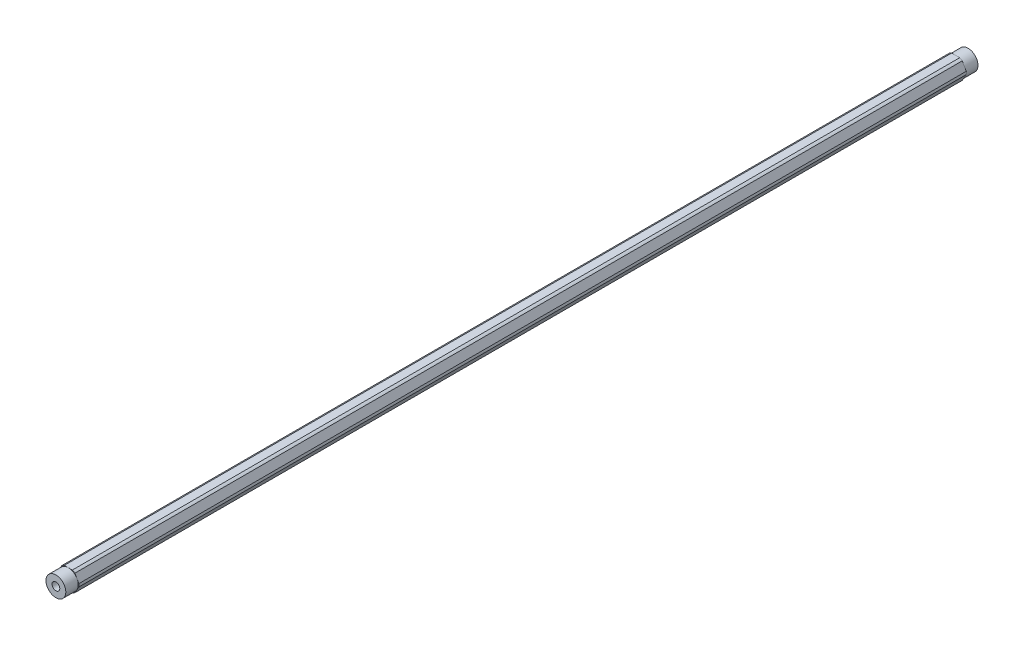
ISO-10303-21;
HEADER;
FILE_DESCRIPTION(('STEP AP214'),'2;1');
FILE_NAME('part.step','',(''),(''),'','','');
FILE_SCHEMA(('AUTOMOTIVE_DESIGN { 1 0 10303 214 1 1 1 1 }'));
ENDSEC;
DATA;
#1=APPLICATION_CONTEXT('core data for automotive mechanical design processes');
#2=APPLICATION_PROTOCOL_DEFINITION('international standard','automotive_design',2000,#1);
#3=PRODUCT_CONTEXT('',#1,'mechanical');
#4=PRODUCT('Part','Part','',(#3));
#5=PRODUCT_RELATED_PRODUCT_CATEGORY('part','',(#4));
#6=PRODUCT_DEFINITION_FORMATION('','',#4);
#7=PRODUCT_DEFINITION_CONTEXT('part definition',#1,'design');
#8=PRODUCT_DEFINITION('design','',#6,#7);
#9=PRODUCT_DEFINITION_SHAPE('','',#8);
#10=(LENGTH_UNIT() NAMED_UNIT(*) SI_UNIT(.MILLI.,.METRE.));
#11=(NAMED_UNIT(*) PLANE_ANGLE_UNIT() SI_UNIT($,.RADIAN.));
#12=(NAMED_UNIT(*) SI_UNIT($,.STERADIAN.) SOLID_ANGLE_UNIT());
#13=UNCERTAINTY_MEASURE_WITH_UNIT(LENGTH_MEASURE(1.E-05),#10,'distance_accuracy_value','');
#14=(GEOMETRIC_REPRESENTATION_CONTEXT(3) GLOBAL_UNCERTAINTY_ASSIGNED_CONTEXT((#13)) GLOBAL_UNIT_ASSIGNED_CONTEXT((#10,
#11,#12)) REPRESENTATION_CONTEXT('',''));
#15=CARTESIAN_POINT('',(0.,0.,0.));
#16=DIRECTION('',(0.,0.,1.));
#17=DIRECTION('',(1.,0.,0.));
#18=AXIS2_PLACEMENT_3D('',#15,#16,#17);
#19=CARTESIAN_POINT('',(3.66617420935413,-6.35,292.1));
#20=DIRECTION('',(-0.866025403784439,0.499999999999999,0.));
#21=DIRECTION('',(-0.499999999999999,-0.866025403784439,0.));
#22=AXIS2_PLACEMENT_3D('',#19,#20,#21);
#23=PLANE('',#22);
#24=DIRECTION('',(0.,0.,1.));
#25=VECTOR('',#24,1.);
#26=CARTESIAN_POINT('',(4.20411035757863,-5.41826726004726,-292.1));
#27=LINE('',#26,#25);
#28=CARTESIAN_POINT('',(4.20411035757863,-5.41826726004727,-284.1498));
#29=VERTEX_POINT('',#28);
#30=CARTESIAN_POINT('',(4.20411035757863,-5.41826726004726,284.1498));
#31=VERTEX_POINT('',#30);
#32=EDGE_CURVE('E327',#29,#31,#27,.T.);
#33=ORIENTED_EDGE('',*,*,#32,.F.);
#34=DIRECTION('',(-0.499999999999999,-0.866025403784439,0.));
#35=VECTOR('',#34,1.);
#36=CARTESIAN_POINT('',(3.66617420935413,-6.35,-284.1498));
#37=LINE('',#36,#35);
#38=CARTESIAN_POINT('',(5.49926131403119,-3.175,-284.1498));
#39=VERTEX_POINT('',#38);
#40=EDGE_CURVE('E257',#39,#29,#37,.T.);
#41=ORIENTED_EDGE('',*,*,#40,.F.);
#42=CARTESIAN_POINT('',(6.79441227048375,-0.931732739952729,-284.1498));
#43=VERTEX_POINT('',#42);
#44=EDGE_CURVE('E261',#43,#39,#37,.T.);
#45=ORIENTED_EDGE('',*,*,#44,.F.);
#46=DIRECTION('',(0.,0.,1.));
#47=VECTOR('',#46,1.);
#48=CARTESIAN_POINT('',(6.79441227048375,-0.931732739952731,-292.1));
#49=LINE('',#48,#47);
#50=CARTESIAN_POINT('',(6.79441227048375,-0.931732739952731,284.1498));
#51=VERTEX_POINT('',#50);
#52=EDGE_CURVE('E299',#51,#43,#49,.F.);
#53=ORIENTED_EDGE('',*,*,#52,.F.);
#54=DIRECTION('',(0.499999999999999,0.866025403784439,0.));
#55=VECTOR('',#54,1.);
#56=CARTESIAN_POINT('',(3.66617420935413,-6.35,284.1498));
#57=LINE('',#56,#55);
#58=CARTESIAN_POINT('',(5.49926131403119,-3.175,284.1498));
#59=VERTEX_POINT('',#58);
#60=EDGE_CURVE('E212',#59,#51,#57,.T.);
#61=ORIENTED_EDGE('',*,*,#60,.F.);
#62=EDGE_CURVE('E211',#31,#59,#57,.T.);
#63=ORIENTED_EDGE('',*,*,#62,.F.);
#64=EDGE_LOOP('',(#33,#41,#45,#53,#61,#63));
#65=FACE_BOUND('',#64,.T.);
#66=ADVANCED_FACE('F48',(#65),#23,.F.);
#67=CARTESIAN_POINT('',(7.33234841870825,0.,292.1));
#68=DIRECTION('',(-0.866025403784439,-0.5,0.));
#69=DIRECTION('',(0.5,-0.866025403784439,0.));
#70=AXIS2_PLACEMENT_3D('',#67,#68,#69);
#71=PLANE('',#70);
#72=DIRECTION('',(0.,0.,1.));
#73=VECTOR('',#72,1.);
#74=CARTESIAN_POINT('',(6.79441227048375,0.931732739952728,-292.1));
#75=LINE('',#74,#73);
#76=CARTESIAN_POINT('',(6.79441227048375,0.931732739952728,-284.1498));
#77=VERTEX_POINT('',#76);
#78=CARTESIAN_POINT('',(6.79441227048375,0.931732739952728,284.1498));
#79=VERTEX_POINT('',#78);
#80=EDGE_CURVE('E302',#77,#79,#75,.T.);
#81=ORIENTED_EDGE('',*,*,#80,.F.);
#82=DIRECTION('',(0.5,-0.866025403784439,0.));
#83=VECTOR('',#82,1.);
#84=CARTESIAN_POINT('',(7.33234841870825,0.,-284.1498));
#85=LINE('',#84,#83);
#86=CARTESIAN_POINT('',(5.49926131403118,3.175,-284.1498));
#87=VERTEX_POINT('',#86);
#88=EDGE_CURVE('E248',#87,#77,#85,.T.);
#89=ORIENTED_EDGE('',*,*,#88,.F.);
#90=CARTESIAN_POINT('',(4.20411035757862,5.41826726004727,-284.1498));
#91=VERTEX_POINT('',#90);
#92=EDGE_CURVE('E252',#91,#87,#85,.T.);
#93=ORIENTED_EDGE('',*,*,#92,.F.);
#94=DIRECTION('',(0.,0.,1.));
#95=VECTOR('',#94,1.);
#96=CARTESIAN_POINT('',(4.20411035757862,5.41826726004727,-292.1));
#97=LINE('',#96,#95);
#98=CARTESIAN_POINT('',(4.20411035757862,5.41826726004727,284.1498));
#99=VERTEX_POINT('',#98);
#100=EDGE_CURVE('E71',#99,#91,#97,.F.);
#101=ORIENTED_EDGE('',*,*,#100,.F.);
#102=DIRECTION('',(-0.5,0.866025403784439,0.));
#103=VECTOR('',#102,1.);
#104=CARTESIAN_POINT('',(7.33234841870825,0.,284.1498));
#105=LINE('',#104,#103);
#106=CARTESIAN_POINT('',(5.49926131403118,3.175,284.1498));
#107=VERTEX_POINT('',#106);
#108=EDGE_CURVE('E217',#107,#99,#105,.T.);
#109=ORIENTED_EDGE('',*,*,#108,.F.);
#110=EDGE_CURVE('E216',#79,#107,#105,.T.);
#111=ORIENTED_EDGE('',*,*,#110,.F.);
#112=EDGE_LOOP('',(#81,#89,#93,#101,#109,#111));
#113=FACE_BOUND('',#112,.T.);
#114=ADVANCED_FACE('F427',(#113),#71,.F.);
#115=CARTESIAN_POINT('',(3.66617420935412,6.35,292.1));
#116=DIRECTION('',(0.,-1.,0.));
#117=DIRECTION('',(0.,0.,-1.));
#118=AXIS2_PLACEMENT_3D('',#115,#116,#117);
#119=PLANE('',#118);
#120=DIRECTION('',(0.,0.,1.));
#121=VECTOR('',#120,1.);
#122=CARTESIAN_POINT('',(2.59030191290514,6.35,-292.1));
#123=LINE('',#122,#121);
#124=CARTESIAN_POINT('',(2.59030191290514,6.35,-284.1498));
#125=VERTEX_POINT('',#124);
#126=CARTESIAN_POINT('',(2.59030191290514,6.35,284.1498));
#127=VERTEX_POINT('',#126);
#128=EDGE_CURVE('E289',#125,#127,#123,.T.);
#129=ORIENTED_EDGE('',*,*,#128,.F.);
#130=DIRECTION('',(1.,0.,0.));
#131=VECTOR('',#130,1.);
#132=CARTESIAN_POINT('',(3.66617420935412,6.35,-284.1498));
#133=LINE('',#132,#131);
#134=CARTESIAN_POINT('',(0.,6.35,-284.1498));
#135=VERTEX_POINT('',#134);
#136=EDGE_CURVE('E242',#135,#125,#133,.T.);
#137=ORIENTED_EDGE('',*,*,#136,.F.);
#138=CARTESIAN_POINT('',(-2.59030191290514,6.35,-284.1498));
#139=VERTEX_POINT('',#138);
#140=EDGE_CURVE('E246',#139,#135,#133,.T.);
#141=ORIENTED_EDGE('',*,*,#140,.F.);
#142=DIRECTION('',(0.,0.,1.));
#143=VECTOR('',#142,1.);
#144=CARTESIAN_POINT('',(-2.59030191290514,6.35,-292.1));
#145=LINE('',#144,#143);
#146=CARTESIAN_POINT('',(-2.59030191290514,6.35,284.1498));
#147=VERTEX_POINT('',#146);
#148=EDGE_CURVE('E63',#147,#139,#145,.F.);
#149=ORIENTED_EDGE('',*,*,#148,.F.);
#150=DIRECTION('',(-1.,0.,0.));
#151=VECTOR('',#150,1.);
#152=CARTESIAN_POINT('',(3.66617420935412,6.35,284.1498));
#153=LINE('',#152,#151);
#154=CARTESIAN_POINT('',(0.,6.35,284.1498));
#155=VERTEX_POINT('',#154);
#156=EDGE_CURVE('E222',#155,#147,#153,.T.);
#157=ORIENTED_EDGE('',*,*,#156,.F.);
#158=EDGE_CURVE('E221',#127,#155,#153,.T.);
#159=ORIENTED_EDGE('',*,*,#158,.F.);
#160=EDGE_LOOP('',(#129,#137,#141,#149,#157,#159));
#161=FACE_BOUND('',#160,.T.);
#162=ADVANCED_FACE('F417',(#161),#119,.F.);
#163=CARTESIAN_POINT('',(-3.66617420935412,6.35,292.1));
#164=DIRECTION('',(0.866025403784439,-0.5,0.));
#165=DIRECTION('',(0.5,0.866025403784439,0.));
#166=AXIS2_PLACEMENT_3D('',#163,#164,#165);
#167=PLANE('',#166);
#168=DIRECTION('',(0.,0.,1.));
#169=VECTOR('',#168,1.);
#170=CARTESIAN_POINT('',(-4.20411035757862,5.41826726004727,-292.1));
#171=LINE('',#170,#169);
#172=CARTESIAN_POINT('',(-4.20411035757862,5.41826726004727,-284.1498));
#173=VERTEX_POINT('',#172);
#174=CARTESIAN_POINT('',(-4.20411035757862,5.41826726004727,284.1498));
#175=VERTEX_POINT('',#174);
#176=EDGE_CURVE('E277',#173,#175,#171,.T.);
#177=ORIENTED_EDGE('',*,*,#176,.F.);
#178=DIRECTION('',(0.5,0.866025403784439,0.));
#179=VECTOR('',#178,1.);
#180=CARTESIAN_POINT('',(-3.66617420935412,6.35,-284.1498));
#181=LINE('',#180,#179);
#182=CARTESIAN_POINT('',(-5.49926131403119,3.175,-284.1498));
#183=VERTEX_POINT('',#182);
#184=EDGE_CURVE('E247',#183,#173,#181,.T.);
#185=ORIENTED_EDGE('',*,*,#184,.F.);
#186=CARTESIAN_POINT('',(-6.79441227048375,0.931732739952721,-284.1498));
#187=VERTEX_POINT('',#186);
#188=EDGE_CURVE('E253',#187,#183,#181,.T.);
#189=ORIENTED_EDGE('',*,*,#188,.F.);
#190=DIRECTION('',(0.,0.,1.));
#191=VECTOR('',#190,1.);
#192=CARTESIAN_POINT('',(-6.79441227048375,0.931732739952721,-292.1));
#193=LINE('',#192,#191);
#194=CARTESIAN_POINT('',(-6.79441227048375,0.931732739952721,284.1498));
#195=VERTEX_POINT('',#194);
#196=EDGE_CURVE('E313',#195,#187,#193,.F.);
#197=ORIENTED_EDGE('',*,*,#196,.F.);
#198=DIRECTION('',(-0.5,-0.866025403784439,0.));
#199=VECTOR('',#198,1.);
#200=CARTESIAN_POINT('',(-3.66617420935412,6.35,284.1498));
#201=LINE('',#200,#199);
#202=CARTESIAN_POINT('',(-5.49926131403119,3.175,284.1498));
#203=VERTEX_POINT('',#202);
#204=EDGE_CURVE('E227',#203,#195,#201,.T.);
#205=ORIENTED_EDGE('',*,*,#204,.F.);
#206=EDGE_CURVE('E226',#175,#203,#201,.T.);
#207=ORIENTED_EDGE('',*,*,#206,.F.);
#208=EDGE_LOOP('',(#177,#185,#189,#197,#205,#207));
#209=FACE_BOUND('',#208,.T.);
#210=ADVANCED_FACE('F433',(#209),#167,.F.);
#211=CARTESIAN_POINT('',(-7.33234841870825,0.,292.1));
#212=DIRECTION('',(0.866025403784439,0.5,0.));
#213=DIRECTION('',(-0.5,0.866025403784439,0.));
#214=AXIS2_PLACEMENT_3D('',#211,#212,#213);
#215=PLANE('',#214);
#216=DIRECTION('',(0.,0.,1.));
#217=VECTOR('',#216,1.);
#218=CARTESIAN_POINT('',(-6.79441227048375,-0.931732739952728,-292.1));
#219=LINE('',#218,#217);
#220=CARTESIAN_POINT('',(-6.79441227048375,-0.931732739952726,-284.1498));
#221=VERTEX_POINT('',#220);
#222=CARTESIAN_POINT('',(-6.79441227048375,-0.931732739952728,284.1498));
#223=VERTEX_POINT('',#222);
#224=EDGE_CURVE('E316',#221,#223,#219,.T.);
#225=ORIENTED_EDGE('',*,*,#224,.F.);
#226=DIRECTION('',(-0.5,0.866025403784439,0.));
#227=VECTOR('',#226,1.);
#228=CARTESIAN_POINT('',(-7.33234841870825,0.,-284.1498));
#229=LINE('',#228,#227);
#230=CARTESIAN_POINT('',(-5.49926131403118,-3.175,-284.1498));
#231=VERTEX_POINT('',#230);
#232=EDGE_CURVE('E256',#231,#221,#229,.T.);
#233=ORIENTED_EDGE('',*,*,#232,.F.);
#234=CARTESIAN_POINT('',(-4.20411035757862,-5.41826726004728,-284.1498));
#235=VERTEX_POINT('',#234);
#236=EDGE_CURVE('E262',#235,#231,#229,.T.);
#237=ORIENTED_EDGE('',*,*,#236,.F.);
#238=DIRECTION('',(0.,0.,1.));
#239=VECTOR('',#238,1.);
#240=CARTESIAN_POINT('',(-4.20411035757862,-5.41826726004727,-292.1));
#241=LINE('',#240,#239);
#242=CARTESIAN_POINT('',(-4.20411035757862,-5.41826726004727,284.1498));
#243=VERTEX_POINT('',#242);
#244=EDGE_CURVE('E176',#243,#235,#241,.F.);
#245=ORIENTED_EDGE('',*,*,#244,.F.);
#246=DIRECTION('',(0.5,-0.866025403784439,0.));
#247=VECTOR('',#246,1.);
#248=CARTESIAN_POINT('',(-7.33234841870825,0.,284.1498));
#249=LINE('',#248,#247);
#250=CARTESIAN_POINT('',(-5.49926131403118,-3.175,284.1498));
#251=VERTEX_POINT('',#250);
#252=EDGE_CURVE('E232',#251,#243,#249,.T.);
#253=ORIENTED_EDGE('',*,*,#252,.F.);
#254=EDGE_CURVE('E231',#223,#251,#249,.T.);
#255=ORIENTED_EDGE('',*,*,#254,.F.);
#256=EDGE_LOOP('',(#225,#233,#237,#245,#253,#255));
#257=FACE_BOUND('',#256,.T.);
#258=ADVANCED_FACE('F450',(#257),#215,.F.);
#259=CARTESIAN_POINT('',(-3.66617420935412,-6.35000000000001,292.1));
#260=DIRECTION('',(0.,1.,0.));
#261=DIRECTION('',(-1.,0.,0.));
#262=AXIS2_PLACEMENT_3D('',#259,#260,#261);
#263=PLANE('',#262);
#264=DIRECTION('',(0.,0.,1.));
#265=VECTOR('',#264,1.);
#266=CARTESIAN_POINT('',(-2.59030191290512,-6.35000000000001,-292.1));
#267=LINE('',#266,#265);
#268=CARTESIAN_POINT('',(-2.59030191290512,-6.35000000000001,-284.1498));
#269=VERTEX_POINT('',#268);
#270=CARTESIAN_POINT('',(-2.59030191290512,-6.35000000000001,284.1498));
#271=VERTEX_POINT('',#270);
#272=EDGE_CURVE('E173',#269,#271,#267,.T.);
#273=ORIENTED_EDGE('',*,*,#272,.F.);
#274=DIRECTION('',(-1.,0.,0.));
#275=VECTOR('',#274,1.);
#276=CARTESIAN_POINT('',(-3.66617420935412,-6.35000000000001,-284.1498));
#277=LINE('',#276,#275);
#278=CARTESIAN_POINT('',(0.,-6.35,-284.1498));
#279=VERTEX_POINT('',#278);
#280=EDGE_CURVE('E185',#279,#269,#277,.T.);
#281=ORIENTED_EDGE('',*,*,#280,.F.);
#282=CARTESIAN_POINT('',(2.59030191290513,-6.35,-284.1498));
#283=VERTEX_POINT('',#282);
#284=EDGE_CURVE('E56',#283,#279,#277,.T.);
#285=ORIENTED_EDGE('',*,*,#284,.F.);
#286=DIRECTION('',(0.,0.,1.));
#287=VECTOR('',#286,1.);
#288=CARTESIAN_POINT('',(2.59030191290513,-6.35,-292.1));
#289=LINE('',#288,#287);
#290=CARTESIAN_POINT('',(2.59030191290513,-6.35,284.1498));
#291=VERTEX_POINT('',#290);
#292=EDGE_CURVE('E330',#291,#283,#289,.F.);
#293=ORIENTED_EDGE('',*,*,#292,.F.);
#294=DIRECTION('',(1.,0.,0.));
#295=VECTOR('',#294,1.);
#296=CARTESIAN_POINT('',(-3.66617420935412,-6.35000000000001,284.1498));
#297=LINE('',#296,#295);
#298=CARTESIAN_POINT('',(0.,-6.35,284.1498));
#299=VERTEX_POINT('',#298);
#300=EDGE_CURVE('E203',#299,#291,#297,.T.);
#301=ORIENTED_EDGE('',*,*,#300,.F.);
#302=EDGE_CURVE('E187',#271,#299,#297,.T.);
#303=ORIENTED_EDGE('',*,*,#302,.F.);
#304=EDGE_LOOP('',(#273,#281,#285,#293,#301,#303));
#305=FACE_BOUND('',#304,.T.);
#306=ADVANCED_FACE('F183',(#305),#263,.F.);
#307=CARTESIAN_POINT('',(0.,0.,284.1498));
#308=DIRECTION('',(0.,0.,1.));
#309=DIRECTION('',(1.,0.,0.));
#310=AXIS2_PLACEMENT_3D('',#307,#308,#309);
#311=PLANE('',#310);
#312=ORIENTED_EDGE('',*,*,#300,.T.);
#313=CARTESIAN_POINT('',(0.,0.,284.1498));
#314=DIRECTION('',(0.,0.,1.));
#315=DIRECTION('',(1.,0.,0.));
#316=AXIS2_PLACEMENT_3D('',#313,#314,#315);
#317=CIRCLE('',#316,6.858);
#318=EDGE_CURVE('E323',#291,#31,#317,.T.);
#319=ORIENTED_EDGE('',*,*,#318,.T.);
#320=ORIENTED_EDGE('',*,*,#62,.T.);
#321=CARTESIAN_POINT('',(0.,0.,284.1498));
#322=DIRECTION('',(0.,0.,1.));
#323=DIRECTION('',(1.,0.,0.));
#324=AXIS2_PLACEMENT_3D('',#321,#322,#323);
#325=CIRCLE('',#324,6.35);
#326=EDGE_CURVE('E375',#299,#59,#325,.T.);
#327=ORIENTED_EDGE('',*,*,#326,.F.);
#328=EDGE_LOOP('',(#312,#319,#320,#327));
#329=FACE_BOUND('',#328,.T.);
#330=ADVANCED_FACE('F480',(#329),#311,.T.);
#331=ORIENTED_EDGE('',*,*,#60,.T.);
#332=CARTESIAN_POINT('',(0.,0.,284.1498));
#333=DIRECTION('',(0.,0.,1.));
#334=DIRECTION('',(1.,0.,0.));
#335=AXIS2_PLACEMENT_3D('',#332,#333,#334);
#336=CIRCLE('',#335,6.858);
#337=EDGE_CURVE('E295',#51,#79,#336,.T.);
#338=ORIENTED_EDGE('',*,*,#337,.T.);
#339=ORIENTED_EDGE('',*,*,#110,.T.);
#340=EDGE_CURVE('E241',#59,#107,#325,.T.);
#341=ORIENTED_EDGE('',*,*,#340,.F.);
#342=EDGE_LOOP('',(#331,#338,#339,#341));
#343=FACE_BOUND('',#342,.T.);
#344=ADVANCED_FACE('F390',(#343),#311,.T.);
#345=ORIENTED_EDGE('',*,*,#108,.T.);
#346=CARTESIAN_POINT('',(0.,0.,284.1498));
#347=DIRECTION('',(0.,0.,1.));
#348=DIRECTION('',(1.,0.,0.));
#349=AXIS2_PLACEMENT_3D('',#346,#347,#348);
#350=CIRCLE('',#349,6.858);
#351=EDGE_CURVE('E283',#99,#127,#350,.T.);
#352=ORIENTED_EDGE('',*,*,#351,.T.);
#353=ORIENTED_EDGE('',*,*,#158,.T.);
#354=EDGE_CURVE('E236',#107,#155,#325,.T.);
#355=ORIENTED_EDGE('',*,*,#354,.F.);
#356=EDGE_LOOP('',(#345,#352,#353,#355));
#357=FACE_BOUND('',#356,.T.);
#358=ADVANCED_FACE('F422',(#357),#311,.T.);
#359=ORIENTED_EDGE('',*,*,#156,.T.);
#360=CARTESIAN_POINT('',(0.,0.,284.1498));
#361=DIRECTION('',(0.,0.,1.));
#362=DIRECTION('',(1.,0.,0.));
#363=AXIS2_PLACEMENT_3D('',#360,#361,#362);
#364=CIRCLE('',#363,6.858);
#365=EDGE_CURVE('E271',#147,#175,#364,.T.);
#366=ORIENTED_EDGE('',*,*,#365,.T.);
#367=ORIENTED_EDGE('',*,*,#206,.T.);
#368=EDGE_CURVE('E240',#155,#203,#325,.T.);
#369=ORIENTED_EDGE('',*,*,#368,.F.);
#370=EDGE_LOOP('',(#359,#366,#367,#369));
#371=FACE_BOUND('',#370,.T.);
#372=ADVANCED_FACE('F438',(#371),#311,.T.);
#373=ORIENTED_EDGE('',*,*,#204,.T.);
#374=CARTESIAN_POINT('',(0.,0.,284.1498));
#375=DIRECTION('',(0.,0.,1.));
#376=DIRECTION('',(1.,0.,0.));
#377=AXIS2_PLACEMENT_3D('',#374,#375,#376);
#378=CIRCLE('',#377,6.858);
#379=EDGE_CURVE('E309',#195,#223,#378,.T.);
#380=ORIENTED_EDGE('',*,*,#379,.T.);
#381=ORIENTED_EDGE('',*,*,#254,.T.);
#382=EDGE_CURVE('E442',#203,#251,#325,.T.);
#383=ORIENTED_EDGE('',*,*,#382,.F.);
#384=EDGE_LOOP('',(#373,#380,#381,#383));
#385=FACE_BOUND('',#384,.T.);
#386=ADVANCED_FACE('F459',(#385),#311,.T.);
#387=ORIENTED_EDGE('',*,*,#252,.T.);
#388=CARTESIAN_POINT('',(0.,0.,284.1498));
#389=DIRECTION('',(0.,0.,1.));
#390=DIRECTION('',(1.,0.,0.));
#391=AXIS2_PLACEMENT_3D('',#388,#389,#390);
#392=CIRCLE('',#391,6.858);
#393=EDGE_CURVE('E337',#243,#271,#392,.T.);
#394=ORIENTED_EDGE('',*,*,#393,.T.);
#395=ORIENTED_EDGE('',*,*,#302,.T.);
#396=EDGE_CURVE('E381',#251,#299,#325,.T.);
#397=ORIENTED_EDGE('',*,*,#396,.F.);
#398=EDGE_LOOP('',(#387,#394,#395,#397));
#399=FACE_BOUND('',#398,.T.);
#400=ADVANCED_FACE('F452',(#399),#311,.T.);
#401=CARTESIAN_POINT('',(0.,0.,-284.1498));
#402=DIRECTION('',(0.,0.,-1.));
#403=DIRECTION('',(-1.,0.,0.));
#404=AXIS2_PLACEMENT_3D('',#401,#402,#403);
#405=PLANE('',#404);
#406=ORIENTED_EDGE('',*,*,#184,.T.);
#407=CARTESIAN_POINT('',(0.,0.,-284.1498));
#408=DIRECTION('',(0.,0.,-1.));
#409=DIRECTION('',(-1.,0.,0.));
#410=AXIS2_PLACEMENT_3D('',#407,#408,#409);
#411=CIRCLE('',#410,6.858);
#412=EDGE_CURVE('E280',#173,#139,#411,.T.);
#413=ORIENTED_EDGE('',*,*,#412,.T.);
#414=ORIENTED_EDGE('',*,*,#140,.T.);
#415=CARTESIAN_POINT('',(0.,0.,-284.1498));
#416=DIRECTION('',(0.,0.,1.));
#417=DIRECTION('',(1.,0.,0.));
#418=AXIS2_PLACEMENT_3D('',#415,#416,#417);
#419=CIRCLE('',#418,6.35);
#420=EDGE_CURVE('E269',#135,#183,#419,.T.);
#421=ORIENTED_EDGE('',*,*,#420,.T.);
#422=EDGE_LOOP('',(#406,#413,#414,#421));
#423=FACE_BOUND('',#422,.T.);
#424=ADVANCED_FACE('F399',(#423),#405,.T.);
#425=ORIENTED_EDGE('',*,*,#136,.T.);
#426=CARTESIAN_POINT('',(0.,0.,-284.1498));
#427=DIRECTION('',(0.,0.,-1.));
#428=DIRECTION('',(-1.,0.,0.));
#429=AXIS2_PLACEMENT_3D('',#426,#427,#428);
#430=CIRCLE('',#429,6.858);
#431=EDGE_CURVE('E292',#125,#91,#430,.T.);
#432=ORIENTED_EDGE('',*,*,#431,.T.);
#433=ORIENTED_EDGE('',*,*,#92,.T.);
#434=EDGE_CURVE('E265',#87,#135,#419,.T.);
#435=ORIENTED_EDGE('',*,*,#434,.T.);
#436=EDGE_LOOP('',(#425,#432,#433,#435));
#437=FACE_BOUND('',#436,.T.);
#438=ADVANCED_FACE('F413',(#437),#405,.T.);
#439=ORIENTED_EDGE('',*,*,#88,.T.);
#440=CARTESIAN_POINT('',(0.,0.,-284.1498));
#441=DIRECTION('',(0.,0.,-1.));
#442=DIRECTION('',(-1.,0.,0.));
#443=AXIS2_PLACEMENT_3D('',#440,#441,#442);
#444=CIRCLE('',#443,6.858);
#445=EDGE_CURVE('E305',#77,#43,#444,.T.);
#446=ORIENTED_EDGE('',*,*,#445,.T.);
#447=ORIENTED_EDGE('',*,*,#44,.T.);
#448=EDGE_CURVE('E270',#39,#87,#419,.T.);
#449=ORIENTED_EDGE('',*,*,#448,.T.);
#450=EDGE_LOOP('',(#439,#446,#447,#449));
#451=FACE_BOUND('',#450,.T.);
#452=ADVANCED_FACE('F469',(#451),#405,.T.);
#453=ORIENTED_EDGE('',*,*,#232,.T.);
#454=CARTESIAN_POINT('',(0.,0.,-284.1498));
#455=DIRECTION('',(0.,0.,-1.));
#456=DIRECTION('',(-1.,0.,0.));
#457=AXIS2_PLACEMENT_3D('',#454,#455,#456);
#458=CIRCLE('',#457,6.858);
#459=EDGE_CURVE('E319',#221,#187,#458,.T.);
#460=ORIENTED_EDGE('',*,*,#459,.T.);
#461=ORIENTED_EDGE('',*,*,#188,.T.);
#462=EDGE_CURVE('E410',#183,#231,#419,.T.);
#463=ORIENTED_EDGE('',*,*,#462,.T.);
#464=EDGE_LOOP('',(#453,#460,#461,#463));
#465=FACE_BOUND('',#464,.T.);
#466=ADVANCED_FACE('F465',(#465),#405,.T.);
#467=ORIENTED_EDGE('',*,*,#40,.T.);
#468=CARTESIAN_POINT('',(0.,0.,-284.1498));
#469=DIRECTION('',(0.,0.,-1.));
#470=DIRECTION('',(-1.,0.,0.));
#471=AXIS2_PLACEMENT_3D('',#468,#469,#470);
#472=CIRCLE('',#471,6.858);
#473=EDGE_CURVE('E333',#29,#283,#472,.T.);
#474=ORIENTED_EDGE('',*,*,#473,.T.);
#475=ORIENTED_EDGE('',*,*,#284,.T.);
#476=EDGE_CURVE('E472',#279,#39,#419,.T.);
#477=ORIENTED_EDGE('',*,*,#476,.T.);
#478=EDGE_LOOP('',(#467,#474,#475,#477));
#479=FACE_BOUND('',#478,.T.);
#480=ADVANCED_FACE('F475',(#479),#405,.T.);
#481=ORIENTED_EDGE('',*,*,#280,.T.);
#482=CARTESIAN_POINT('',(0.,0.,-284.1498));
#483=DIRECTION('',(0.,0.,-1.));
#484=DIRECTION('',(-1.,0.,0.));
#485=AXIS2_PLACEMENT_3D('',#482,#483,#484);
#486=CIRCLE('',#485,6.858);
#487=EDGE_CURVE('E12',#269,#235,#486,.T.);
#488=ORIENTED_EDGE('',*,*,#487,.T.);
#489=ORIENTED_EDGE('',*,*,#236,.T.);
#490=EDGE_CURVE('E194',#231,#279,#419,.T.);
#491=ORIENTED_EDGE('',*,*,#490,.T.);
#492=EDGE_LOOP('',(#481,#488,#489,#491));
#493=FACE_BOUND('',#492,.T.);
#494=ADVANCED_FACE('F192',(#493),#405,.T.);
#495=CARTESIAN_POINT('',(0.,0.,284.1498));
#496=DIRECTION('',(0.,0.,1.));
#497=DIRECTION('',(1.,0.,0.));
#498=AXIS2_PLACEMENT_3D('',#495,#496,#497);
#499=CYLINDRICAL_SURFACE('',#498,6.35);
#500=CARTESIAN_POINT('',(0.,0.,292.1));
#501=DIRECTION('',(0.,0.,1.));
#502=DIRECTION('',(1.,0.,0.));
#503=AXIS2_PLACEMENT_3D('',#500,#501,#502);
#504=CIRCLE('',#503,6.35);
#505=CARTESIAN_POINT('',(6.35,0.,292.1));
#506=VERTEX_POINT('',#505);
#507=EDGE_CURVE('E207',#506,#506,#504,.T.);
#508=ORIENTED_EDGE('',*,*,#507,.F.);
#509=EDGE_LOOP('',(#508));
#510=FACE_BOUND('',#509,.T.);
#511=ORIENTED_EDGE('',*,*,#326,.T.);
#512=ORIENTED_EDGE('',*,*,#340,.T.);
#513=ORIENTED_EDGE('',*,*,#354,.T.);
#514=ORIENTED_EDGE('',*,*,#368,.T.);
#515=ORIENTED_EDGE('',*,*,#382,.T.);
#516=ORIENTED_EDGE('',*,*,#396,.T.);
#517=EDGE_LOOP('',(#511,#512,#513,#514,#515,#516));
#518=FACE_BOUND('',#517,.T.);
#519=ADVANCED_FACE('F364',(#510,#518),#499,.T.);
#520=CARTESIAN_POINT('',(0.,0.,292.1));
#521=DIRECTION('',(0.,0.,1.));
#522=DIRECTION('',(1.,0.,0.));
#523=AXIS2_PLACEMENT_3D('',#520,#521,#522);
#524=PLANE('',#523);
#525=CARTESIAN_POINT('',(0.,0.,292.1));
#526=DIRECTION('',(0.,0.,1.));
#527=DIRECTION('',(1.,0.,0.));
#528=AXIS2_PLACEMENT_3D('',#525,#526,#527);
#529=CIRCLE('',#528,2.4892);
#530=CARTESIAN_POINT('',(2.4892,0.,292.1));
#531=VERTEX_POINT('',#530);
#532=EDGE_CURVE('E342',#531,#531,#529,.T.);
#533=ORIENTED_EDGE('',*,*,#532,.F.);
#534=EDGE_LOOP('',(#533));
#535=FACE_BOUND('',#534,.T.);
#536=ORIENTED_EDGE('',*,*,#507,.T.);
#537=EDGE_LOOP('',(#536));
#538=FACE_BOUND('',#537,.T.);
#539=ADVANCED_FACE('F360',(#535,#538),#524,.T.);
#540=CARTESIAN_POINT('',(0.,0.,-284.1498));
#541=DIRECTION('',(0.,0.,-1.));
#542=DIRECTION('',(-1.,0.,0.));
#543=AXIS2_PLACEMENT_3D('',#540,#541,#542);
#544=CYLINDRICAL_SURFACE('',#543,6.35);
#545=ORIENTED_EDGE('',*,*,#448,.F.);
#546=ORIENTED_EDGE('',*,*,#476,.F.);
#547=ORIENTED_EDGE('',*,*,#490,.F.);
#548=ORIENTED_EDGE('',*,*,#462,.F.);
#549=ORIENTED_EDGE('',*,*,#420,.F.);
#550=ORIENTED_EDGE('',*,*,#434,.F.);
#551=EDGE_LOOP('',(#545,#546,#547,#548,#549,#550));
#552=FACE_BOUND('',#551,.T.);
#553=CARTESIAN_POINT('',(0.,0.,-292.1));
#554=DIRECTION('',(0.,0.,1.));
#555=DIRECTION('',(1.,0.,0.));
#556=AXIS2_PLACEMENT_3D('',#553,#554,#555);
#557=CIRCLE('',#556,6.35);
#558=CARTESIAN_POINT('',(6.35,0.,-292.1));
#559=VERTEX_POINT('',#558);
#560=EDGE_CURVE('E197',#559,#559,#557,.F.);
#561=ORIENTED_EDGE('',*,*,#560,.F.);
#562=EDGE_LOOP('',(#561));
#563=FACE_BOUND('',#562,.T.);
#564=ADVANCED_FACE('F363',(#552,#563),#544,.T.);
#565=CARTESIAN_POINT('',(0.,0.,-292.1));
#566=DIRECTION('',(0.,0.,1.));
#567=DIRECTION('',(1.,0.,0.));
#568=AXIS2_PLACEMENT_3D('',#565,#566,#567);
#569=PLANE('',#568);
#570=CARTESIAN_POINT('',(0.,0.,-292.1));
#571=DIRECTION('',(0.,0.,1.));
#572=DIRECTION('',(1.,0.,0.));
#573=AXIS2_PLACEMENT_3D('',#570,#571,#572);
#574=CIRCLE('',#573,2.4892);
#575=CARTESIAN_POINT('',(2.4892,0.,-292.1));
#576=VERTEX_POINT('',#575);
#577=EDGE_CURVE('E189',#576,#576,#574,.T.);
#578=ORIENTED_EDGE('',*,*,#577,.T.);
#579=EDGE_LOOP('',(#578));
#580=FACE_BOUND('',#579,.T.);
#581=ORIENTED_EDGE('',*,*,#560,.T.);
#582=EDGE_LOOP('',(#581));
#583=FACE_BOUND('',#582,.T.);
#584=ADVANCED_FACE('F350',(#580,#583),#569,.F.);
#585=CARTESIAN_POINT('',(0.,0.,-292.1));
#586=DIRECTION('',(0.,0.,1.));
#587=DIRECTION('',(1.,0.,0.));
#588=AXIS2_PLACEMENT_3D('',#585,#586,#587);
#589=CYLINDRICAL_SURFACE('',#588,6.858);
#590=ORIENTED_EDGE('',*,*,#244,.T.);
#591=ORIENTED_EDGE('',*,*,#487,.F.);
#592=ORIENTED_EDGE('',*,*,#272,.T.);
#593=ORIENTED_EDGE('',*,*,#393,.F.);
#594=EDGE_LOOP('',(#590,#591,#592,#593));
#595=FACE_BOUND('',#594,.T.);
#596=ADVANCED_FACE('F172',(#595),#589,.T.);
#597=ORIENTED_EDGE('',*,*,#292,.T.);
#598=ORIENTED_EDGE('',*,*,#473,.F.);
#599=ORIENTED_EDGE('',*,*,#32,.T.);
#600=ORIENTED_EDGE('',*,*,#318,.F.);
#601=EDGE_LOOP('',(#597,#598,#599,#600));
#602=FACE_BOUND('',#601,.T.);
#603=ADVANCED_FACE('F478',(#602),#589,.T.);
#604=ORIENTED_EDGE('',*,*,#196,.T.);
#605=ORIENTED_EDGE('',*,*,#459,.F.);
#606=ORIENTED_EDGE('',*,*,#224,.T.);
#607=ORIENTED_EDGE('',*,*,#379,.F.);
#608=EDGE_LOOP('',(#604,#605,#606,#607));
#609=FACE_BOUND('',#608,.T.);
#610=ADVANCED_FACE('F461',(#609),#589,.T.);
#611=ORIENTED_EDGE('',*,*,#52,.T.);
#612=ORIENTED_EDGE('',*,*,#445,.F.);
#613=ORIENTED_EDGE('',*,*,#80,.T.);
#614=ORIENTED_EDGE('',*,*,#337,.F.);
#615=EDGE_LOOP('',(#611,#612,#613,#614));
#616=FACE_BOUND('',#615,.T.);
#617=ADVANCED_FACE('F621',(#616),#589,.T.);
#618=ORIENTED_EDGE('',*,*,#100,.T.);
#619=ORIENTED_EDGE('',*,*,#431,.F.);
#620=ORIENTED_EDGE('',*,*,#128,.T.);
#621=ORIENTED_EDGE('',*,*,#351,.F.);
#622=EDGE_LOOP('',(#618,#619,#620,#621));
#623=FACE_BOUND('',#622,.T.);
#624=ADVANCED_FACE('F420',(#623),#589,.T.);
#625=ORIENTED_EDGE('',*,*,#148,.T.);
#626=ORIENTED_EDGE('',*,*,#412,.F.);
#627=ORIENTED_EDGE('',*,*,#176,.T.);
#628=ORIENTED_EDGE('',*,*,#365,.F.);
#629=EDGE_LOOP('',(#625,#626,#627,#628));
#630=FACE_BOUND('',#629,.T.);
#631=ADVANCED_FACE('F356',(#630),#589,.T.);
#632=CARTESIAN_POINT('',(0.,0.,-292.1));
#633=DIRECTION('',(0.,0.,1.));
#634=DIRECTION('',(1.,0.,0.));
#635=AXIS2_PLACEMENT_3D('',#632,#633,#634);
#636=CYLINDRICAL_SURFACE('',#635,2.4892);
#637=ORIENTED_EDGE('',*,*,#577,.F.);
#638=EDGE_LOOP('',(#637));
#639=FACE_BOUND('',#638,.T.);
#640=ORIENTED_EDGE('',*,*,#532,.T.);
#641=EDGE_LOOP('',(#640));
#642=FACE_BOUND('',#641,.T.);
#643=ADVANCED_FACE('F353',(#639,#642),#636,.F.);
#644=CLOSED_SHELL('',(#66,#114,#162,#210,#258,#306,#330,#344,#358,#372,#386,#400,#424,#438,#452,
#466,#480,#494,#519,#539,#564,#584,#596,#603,#610,#617,#624,#631,#643));
#645=MANIFOLD_SOLID_BREP('B2',#644);
#646=ADVANCED_BREP_SHAPE_REPRESENTATION('',(#18,#645),#14);
#647=SHAPE_DEFINITION_REPRESENTATION(#9,#646);
ENDSEC;
END-ISO-10303-21;
